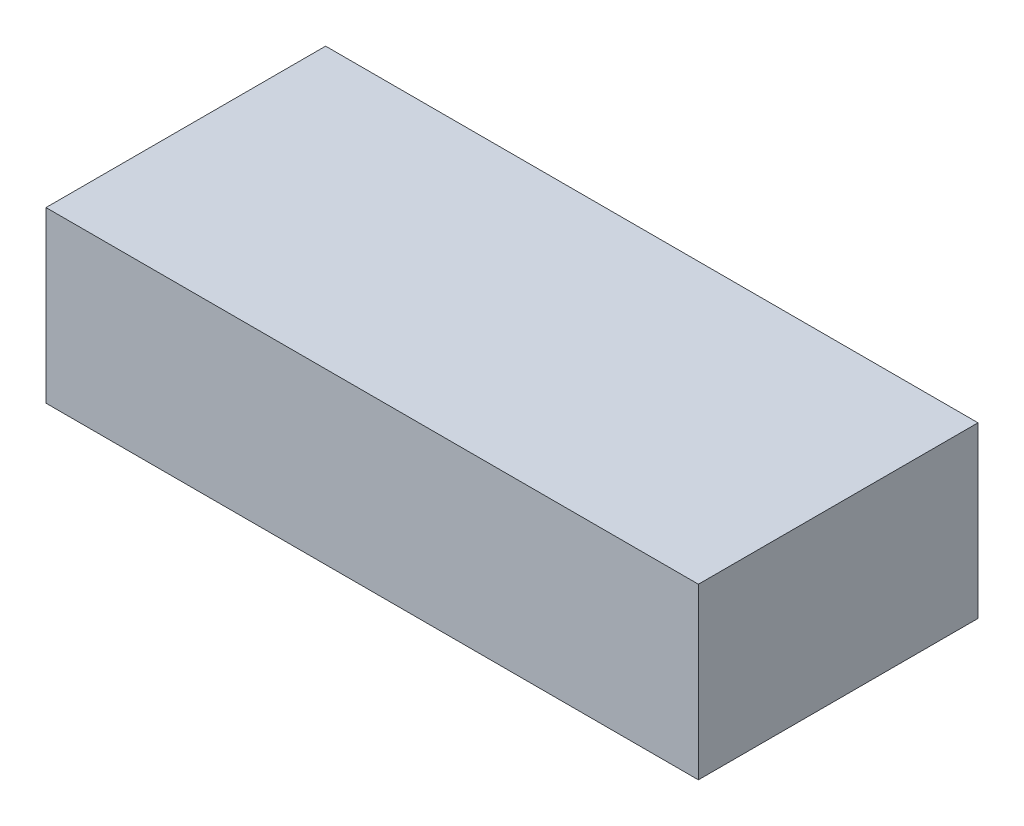
ISO-10303-21;
HEADER;
FILE_DESCRIPTION(('STEP AP214'),'2;1');
FILE_NAME('part.step','',(''),(''),'','','');
FILE_SCHEMA(('AUTOMOTIVE_DESIGN { 1 0 10303 214 1 1 1 1 }'));
ENDSEC;
DATA;
#1=APPLICATION_CONTEXT('core data for automotive mechanical design processes');
#2=APPLICATION_PROTOCOL_DEFINITION('international standard','automotive_design',2000,#1);
#3=PRODUCT_CONTEXT('',#1,'mechanical');
#4=PRODUCT('Part','Part','',(#3));
#5=PRODUCT_RELATED_PRODUCT_CATEGORY('part','',(#4));
#6=PRODUCT_DEFINITION_FORMATION('','',#4);
#7=PRODUCT_DEFINITION_CONTEXT('part definition',#1,'design');
#8=PRODUCT_DEFINITION('design','',#6,#7);
#9=PRODUCT_DEFINITION_SHAPE('','',#8);
#10=(LENGTH_UNIT() NAMED_UNIT(*) SI_UNIT(.MILLI.,.METRE.));
#11=(NAMED_UNIT(*) PLANE_ANGLE_UNIT() SI_UNIT($,.RADIAN.));
#12=(NAMED_UNIT(*) SI_UNIT($,.STERADIAN.) SOLID_ANGLE_UNIT());
#13=UNCERTAINTY_MEASURE_WITH_UNIT(LENGTH_MEASURE(1.E-05),#10,'distance_accuracy_value','');
#14=(GEOMETRIC_REPRESENTATION_CONTEXT(3) GLOBAL_UNCERTAINTY_ASSIGNED_CONTEXT((#13)) GLOBAL_UNIT_ASSIGNED_CONTEXT((#10,
#11,#12)) REPRESENTATION_CONTEXT('',''));
#15=CARTESIAN_POINT('',(0.,0.,0.));
#16=DIRECTION('',(0.,0.,1.));
#17=DIRECTION('',(1.,0.,0.));
#18=AXIS2_PLACEMENT_3D('',#15,#16,#17);
#19=CARTESIAN_POINT('',(0.,20.,0.));
#20=DIRECTION('',(1.,0.,0.));
#21=DIRECTION('',(0.,0.,-1.));
#22=AXIS2_PLACEMENT_3D('',#19,#20,#21);
#23=PLANE('',#22);
#24=DIRECTION('',(0.,0.,1.));
#25=VECTOR('',#24,1.);
#26=CARTESIAN_POINT('',(0.,0.,0.));
#27=LINE('',#26,#25);
#28=CARTESIAN_POINT('',(0.,0.,-33.));
#29=VERTEX_POINT('',#28);
#30=CARTESIAN_POINT('',(0.,0.,0.));
#31=VERTEX_POINT('',#30);
#32=EDGE_CURVE('E99',#29,#31,#27,.T.);
#33=ORIENTED_EDGE('',*,*,#32,.T.);
#34=DIRECTION('',(0.,-1.,0.));
#35=VECTOR('',#34,1.);
#36=CARTESIAN_POINT('',(0.,20.,0.));
#37=LINE('',#36,#35);
#38=CARTESIAN_POINT('',(0.,20.,0.));
#39=VERTEX_POINT('',#38);
#40=EDGE_CURVE('E11',#39,#31,#37,.T.);
#41=ORIENTED_EDGE('',*,*,#40,.F.);
#42=DIRECTION('',(0.,0.,1.));
#43=VECTOR('',#42,1.);
#44=CARTESIAN_POINT('',(0.,20.,0.));
#45=LINE('',#44,#43);
#46=CARTESIAN_POINT('',(0.,20.,-33.));
#47=VERTEX_POINT('',#46);
#48=EDGE_CURVE('E87',#47,#39,#45,.T.);
#49=ORIENTED_EDGE('',*,*,#48,.F.);
#50=DIRECTION('',(0.,-1.,0.));
#51=VECTOR('',#50,1.);
#52=CARTESIAN_POINT('',(0.,20.,-33.));
#53=LINE('',#52,#51);
#54=EDGE_CURVE('E95',#47,#29,#53,.T.);
#55=ORIENTED_EDGE('',*,*,#54,.T.);
#56=EDGE_LOOP('',(#33,#41,#49,#55));
#57=FACE_BOUND('',#56,.T.);
#58=ADVANCED_FACE('F36',(#57),#23,.F.);
#59=CARTESIAN_POINT('',(0.,20.,0.));
#60=DIRECTION('',(0.,0.,-1.));
#61=DIRECTION('',(-1.,0.,0.));
#62=AXIS2_PLACEMENT_3D('',#59,#60,#61);
#63=PLANE('',#62);
#64=DIRECTION('',(1.,0.,0.));
#65=VECTOR('',#64,1.);
#66=CARTESIAN_POINT('',(0.,0.,0.));
#67=LINE('',#66,#65);
#68=CARTESIAN_POINT('',(77.,0.,0.));
#69=VERTEX_POINT('',#68);
#70=EDGE_CURVE('E91',#31,#69,#67,.T.);
#71=ORIENTED_EDGE('',*,*,#70,.T.);
#72=DIRECTION('',(0.,-1.,0.));
#73=VECTOR('',#72,1.);
#74=CARTESIAN_POINT('',(77.,20.,0.));
#75=LINE('',#74,#73);
#76=CARTESIAN_POINT('',(77.,20.,0.));
#77=VERTEX_POINT('',#76);
#78=EDGE_CURVE('E44',#77,#69,#75,.T.);
#79=ORIENTED_EDGE('',*,*,#78,.F.);
#80=DIRECTION('',(1.,0.,0.));
#81=VECTOR('',#80,1.);
#82=CARTESIAN_POINT('',(0.,20.,0.));
#83=LINE('',#82,#81);
#84=EDGE_CURVE('E82',#39,#77,#83,.T.);
#85=ORIENTED_EDGE('',*,*,#84,.F.);
#86=ORIENTED_EDGE('',*,*,#40,.T.);
#87=EDGE_LOOP('',(#71,#79,#85,#86));
#88=FACE_BOUND('',#87,.T.);
#89=ADVANCED_FACE('F90',(#88),#63,.F.);
#90=CARTESIAN_POINT('',(77.,20.,0.));
#91=DIRECTION('',(-1.,0.,0.));
#92=DIRECTION('',(0.,0.,1.));
#93=AXIS2_PLACEMENT_3D('',#90,#91,#92);
#94=PLANE('',#93);
#95=DIRECTION('',(0.,0.,-1.));
#96=VECTOR('',#95,1.);
#97=CARTESIAN_POINT('',(77.,0.,0.));
#98=LINE('',#97,#96);
#99=CARTESIAN_POINT('',(77.,0.,-33.));
#100=VERTEX_POINT('',#99);
#101=EDGE_CURVE('E69',#69,#100,#98,.T.);
#102=ORIENTED_EDGE('',*,*,#101,.T.);
#103=DIRECTION('',(0.,-1.,0.));
#104=VECTOR('',#103,1.);
#105=CARTESIAN_POINT('',(77.,20.,-33.));
#106=LINE('',#105,#104);
#107=CARTESIAN_POINT('',(77.,20.,-33.));
#108=VERTEX_POINT('',#107);
#109=EDGE_CURVE('E92',#108,#100,#106,.T.);
#110=ORIENTED_EDGE('',*,*,#109,.F.);
#111=DIRECTION('',(0.,0.,-1.));
#112=VECTOR('',#111,1.);
#113=CARTESIAN_POINT('',(77.,20.,0.));
#114=LINE('',#113,#112);
#115=EDGE_CURVE('E85',#77,#108,#114,.T.);
#116=ORIENTED_EDGE('',*,*,#115,.F.);
#117=ORIENTED_EDGE('',*,*,#78,.T.);
#118=EDGE_LOOP('',(#102,#110,#116,#117));
#119=FACE_BOUND('',#118,.T.);
#120=ADVANCED_FACE('F93',(#119),#94,.F.);
#121=CARTESIAN_POINT('',(0.,20.,-33.));
#122=DIRECTION('',(0.,0.,1.));
#123=DIRECTION('',(1.,0.,0.));
#124=AXIS2_PLACEMENT_3D('',#121,#122,#123);
#125=PLANE('',#124);
#126=DIRECTION('',(-1.,0.,0.));
#127=VECTOR('',#126,1.);
#128=CARTESIAN_POINT('',(0.,0.,-33.));
#129=LINE('',#128,#127);
#130=EDGE_CURVE('E75',#100,#29,#129,.T.);
#131=ORIENTED_EDGE('',*,*,#130,.T.);
#132=ORIENTED_EDGE('',*,*,#54,.F.);
#133=DIRECTION('',(-1.,0.,0.));
#134=VECTOR('',#133,1.);
#135=CARTESIAN_POINT('',(0.,20.,-33.));
#136=LINE('',#135,#134);
#137=EDGE_CURVE('E52',#108,#47,#136,.T.);
#138=ORIENTED_EDGE('',*,*,#137,.F.);
#139=ORIENTED_EDGE('',*,*,#109,.T.);
#140=EDGE_LOOP('',(#131,#132,#138,#139));
#141=FACE_BOUND('',#140,.T.);
#142=ADVANCED_FACE('F106',(#141),#125,.F.);
#143=CARTESIAN_POINT('',(0.,20.,0.));
#144=DIRECTION('',(0.,-1.,0.));
#145=DIRECTION('',(0.,0.,-1.));
#146=AXIS2_PLACEMENT_3D('',#143,#144,#145);
#147=PLANE('',#146);
#148=ORIENTED_EDGE('',*,*,#48,.T.);
#149=ORIENTED_EDGE('',*,*,#84,.T.);
#150=ORIENTED_EDGE('',*,*,#115,.T.);
#151=ORIENTED_EDGE('',*,*,#137,.T.);
#152=EDGE_LOOP('',(#148,#149,#150,#151));
#153=FACE_BOUND('',#152,.T.);
#154=ADVANCED_FACE('F83',(#153),#147,.F.);
#155=CARTESIAN_POINT('',(0.,0.,0.));
#156=DIRECTION('',(0.,-1.,0.));
#157=DIRECTION('',(0.,0.,-1.));
#158=AXIS2_PLACEMENT_3D('',#155,#156,#157);
#159=PLANE('',#158);
#160=ORIENTED_EDGE('',*,*,#32,.F.);
#161=ORIENTED_EDGE('',*,*,#130,.F.);
#162=ORIENTED_EDGE('',*,*,#101,.F.);
#163=ORIENTED_EDGE('',*,*,#70,.F.);
#164=EDGE_LOOP('',(#160,#161,#162,#163));
#165=FACE_BOUND('',#164,.T.);
#166=ADVANCED_FACE('F109',(#165),#159,.T.);
#167=CLOSED_SHELL('',(#58,#89,#120,#142,#154,#166));
#168=MANIFOLD_SOLID_BREP('B2',#167);
#169=ADVANCED_BREP_SHAPE_REPRESENTATION('',(#18,#168),#14);
#170=SHAPE_DEFINITION_REPRESENTATION(#9,#169);
ENDSEC;
END-ISO-10303-21;
